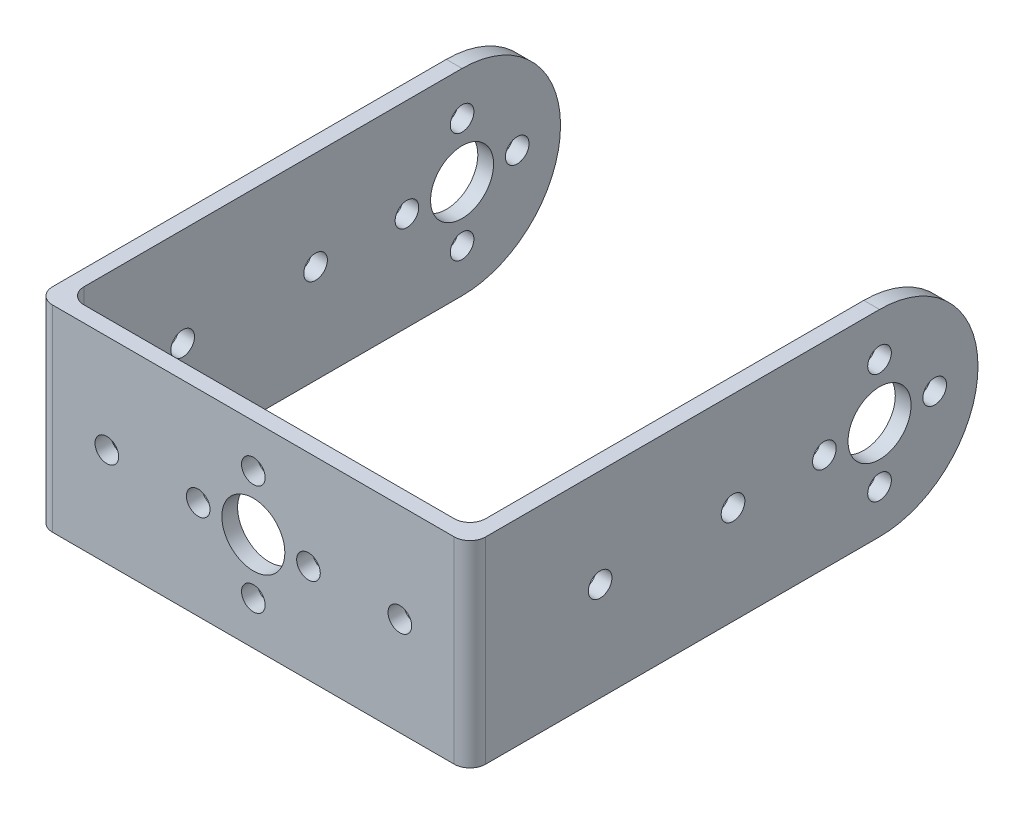
ISO-10303-21;
HEADER;
FILE_DESCRIPTION(('STEP AP214'),'2;1');
FILE_NAME('part.step','',(''),(''),'','','');
FILE_SCHEMA(('AUTOMOTIVE_DESIGN { 1 0 10303 214 1 1 1 1 }'));
ENDSEC;
DATA;
#1=APPLICATION_CONTEXT('core data for automotive mechanical design processes');
#2=APPLICATION_PROTOCOL_DEFINITION('international standard','automotive_design',2000,#1);
#3=PRODUCT_CONTEXT('',#1,'mechanical');
#4=PRODUCT('Part','Part','',(#3));
#5=PRODUCT_RELATED_PRODUCT_CATEGORY('part','',(#4));
#6=PRODUCT_DEFINITION_FORMATION('','',#4);
#7=PRODUCT_DEFINITION_CONTEXT('part definition',#1,'design');
#8=PRODUCT_DEFINITION('design','',#6,#7);
#9=PRODUCT_DEFINITION_SHAPE('','',#8);
#10=(LENGTH_UNIT() NAMED_UNIT(*) SI_UNIT(.MILLI.,.METRE.));
#11=(NAMED_UNIT(*) PLANE_ANGLE_UNIT() SI_UNIT($,.RADIAN.));
#12=(NAMED_UNIT(*) SI_UNIT($,.STERADIAN.) SOLID_ANGLE_UNIT());
#13=UNCERTAINTY_MEASURE_WITH_UNIT(LENGTH_MEASURE(1.E-05),#10,'distance_accuracy_value','');
#14=(GEOMETRIC_REPRESENTATION_CONTEXT(3) GLOBAL_UNCERTAINTY_ASSIGNED_CONTEXT((#13)) GLOBAL_UNIT_ASSIGNED_CONTEXT((#10,
#11,#12)) REPRESENTATION_CONTEXT('',''));
#15=CARTESIAN_POINT('',(0.,0.,0.));
#16=DIRECTION('',(0.,0.,1.));
#17=DIRECTION('',(1.,0.,0.));
#18=AXIS2_PLACEMENT_3D('',#15,#16,#17);
#19=CARTESIAN_POINT('',(0.,0.,0.));
#20=DIRECTION('',(0.,1.,0.));
#21=DIRECTION('',(0.,0.,1.));
#22=AXIS2_PLACEMENT_3D('',#19,#20,#21);
#23=PLANE('',#22);
#24=DIRECTION('',(0.,0.,-1.));
#25=VECTOR('',#24,1.);
#26=CARTESIAN_POINT('',(27.5,0.,0.));
#27=LINE('',#26,#25);
#28=CARTESIAN_POINT('',(27.5,0.,-2.));
#29=VERTEX_POINT('',#28);
#30=CARTESIAN_POINT('',(27.5,0.,-52.));
#31=VERTEX_POINT('',#30);
#32=EDGE_CURVE('E390',#29,#31,#27,.T.);
#33=ORIENTED_EDGE('',*,*,#32,.F.);
#34=CARTESIAN_POINT('',(25.5,0.,-2.));
#35=DIRECTION('',(0.,1.,0.));
#36=DIRECTION('',(0.,0.,1.));
#37=AXIS2_PLACEMENT_3D('',#34,#35,#36);
#38=CIRCLE('',#37,2.);
#39=CARTESIAN_POINT('',(25.5,0.,0.));
#40=VERTEX_POINT('',#39);
#41=EDGE_CURVE('E454',#29,#40,#38,.F.);
#42=ORIENTED_EDGE('',*,*,#41,.T.);
#43=DIRECTION('',(1.,0.,0.));
#44=VECTOR('',#43,1.);
#45=CARTESIAN_POINT('',(0.,0.,0.));
#46=LINE('',#45,#44);
#47=CARTESIAN_POINT('',(-25.5,0.,0.));
#48=VERTEX_POINT('',#47);
#49=EDGE_CURVE('E388',#48,#40,#46,.T.);
#50=ORIENTED_EDGE('',*,*,#49,.F.);
#51=CARTESIAN_POINT('',(-25.5,0.,-2.));
#52=DIRECTION('',(0.,1.,0.));
#53=DIRECTION('',(0.,0.,1.));
#54=AXIS2_PLACEMENT_3D('',#51,#52,#53);
#55=CIRCLE('',#54,2.);
#56=CARTESIAN_POINT('',(-27.5,0.,-2.));
#57=VERTEX_POINT('',#56);
#58=EDGE_CURVE('E278',#48,#57,#55,.F.);
#59=ORIENTED_EDGE('',*,*,#58,.T.);
#60=DIRECTION('',(0.,0.,-1.));
#61=VECTOR('',#60,1.);
#62=CARTESIAN_POINT('',(-27.5,0.,0.));
#63=LINE('',#62,#61);
#64=CARTESIAN_POINT('',(-27.5,0.,-52.));
#65=VERTEX_POINT('',#64);
#66=EDGE_CURVE('E270',#57,#65,#63,.T.);
#67=ORIENTED_EDGE('',*,*,#66,.T.);
#68=DIRECTION('',(-1.,0.,0.));
#69=VECTOR('',#68,1.);
#70=CARTESIAN_POINT('',(-2.5,0.,-52.));
#71=LINE('',#70,#69);
#72=CARTESIAN_POINT('',(-25.5,0.,-52.));
#73=VERTEX_POINT('',#72);
#74=EDGE_CURVE('E275',#73,#65,#71,.T.);
#75=ORIENTED_EDGE('',*,*,#74,.F.);
#76=DIRECTION('',(0.,0.,1.));
#77=VECTOR('',#76,1.);
#78=CARTESIAN_POINT('',(-25.5,0.,-64.5));
#79=LINE('',#78,#77);
#80=CARTESIAN_POINT('',(-25.5,0.,-4.));
#81=VERTEX_POINT('',#80);
#82=EDGE_CURVE('E280',#73,#81,#79,.T.);
#83=ORIENTED_EDGE('',*,*,#82,.T.);
#84=CARTESIAN_POINT('',(-23.5,0.,-4.));
#85=DIRECTION('',(0.,1.,0.));
#86=DIRECTION('',(0.,0.,1.));
#87=AXIS2_PLACEMENT_3D('',#84,#85,#86);
#88=CIRCLE('',#87,2.);
#89=CARTESIAN_POINT('',(-23.5,0.,-2.));
#90=VERTEX_POINT('',#89);
#91=EDGE_CURVE('E188',#81,#90,#88,.T.);
#92=ORIENTED_EDGE('',*,*,#91,.T.);
#93=DIRECTION('',(-1.,0.,0.));
#94=VECTOR('',#93,1.);
#95=CARTESIAN_POINT('',(25.5,0.,-2.));
#96=LINE('',#95,#94);
#97=CARTESIAN_POINT('',(23.5,0.,-2.));
#98=VERTEX_POINT('',#97);
#99=EDGE_CURVE('E379',#98,#90,#96,.T.);
#100=ORIENTED_EDGE('',*,*,#99,.F.);
#101=CARTESIAN_POINT('',(23.5,0.,-4.));
#102=DIRECTION('',(0.,1.,0.));
#103=DIRECTION('',(0.,0.,1.));
#104=AXIS2_PLACEMENT_3D('',#101,#102,#103);
#105=CIRCLE('',#104,2.);
#106=CARTESIAN_POINT('',(25.5,0.,-4.));
#107=VERTEX_POINT('',#106);
#108=EDGE_CURVE('E465',#98,#107,#105,.T.);
#109=ORIENTED_EDGE('',*,*,#108,.T.);
#110=DIRECTION('',(0.,0.,1.));
#111=VECTOR('',#110,1.);
#112=CARTESIAN_POINT('',(25.5,0.,-64.5));
#113=LINE('',#112,#111);
#114=CARTESIAN_POINT('',(25.5,0.,-52.));
#115=VERTEX_POINT('',#114);
#116=EDGE_CURVE('E393',#115,#107,#113,.T.);
#117=ORIENTED_EDGE('',*,*,#116,.F.);
#118=DIRECTION('',(1.,0.,0.));
#119=VECTOR('',#118,1.);
#120=CARTESIAN_POINT('',(2.5,0.,-52.));
#121=LINE('',#120,#119);
#122=EDGE_CURVE('E387',#31,#115,#121,.F.);
#123=ORIENTED_EDGE('',*,*,#122,.F.);
#124=EDGE_LOOP('',(#33,#42,#50,#59,#67,#75,#83,#92,#100,#109,#117,#123));
#125=FACE_BOUND('',#124,.T.);
#126=ADVANCED_FACE('F180',(#125),#23,.F.);
#127=CARTESIAN_POINT('',(0.,25.,0.));
#128=DIRECTION('',(0.,1.,0.));
#129=DIRECTION('',(0.,0.,1.));
#130=AXIS2_PLACEMENT_3D('',#127,#128,#129);
#131=PLANE('',#130);
#132=DIRECTION('',(1.,0.,0.));
#133=VECTOR('',#132,1.);
#134=CARTESIAN_POINT('',(0.,25.,0.));
#135=LINE('',#134,#133);
#136=CARTESIAN_POINT('',(-25.5,25.,0.));
#137=VERTEX_POINT('',#136);
#138=CARTESIAN_POINT('',(25.5,25.,0.));
#139=VERTEX_POINT('',#138);
#140=EDGE_CURVE('E376',#137,#139,#135,.T.);
#141=ORIENTED_EDGE('',*,*,#140,.T.);
#142=CARTESIAN_POINT('',(25.5,25.,-2.));
#143=DIRECTION('',(0.,1.,0.));
#144=DIRECTION('',(0.,0.,1.));
#145=AXIS2_PLACEMENT_3D('',#142,#143,#144);
#146=CIRCLE('',#145,2.);
#147=CARTESIAN_POINT('',(27.5,25.,-2.));
#148=VERTEX_POINT('',#147);
#149=EDGE_CURVE('E462',#139,#148,#146,.T.);
#150=ORIENTED_EDGE('',*,*,#149,.T.);
#151=DIRECTION('',(0.,0.,-1.));
#152=VECTOR('',#151,1.);
#153=CARTESIAN_POINT('',(27.5,25.,0.));
#154=LINE('',#153,#152);
#155=CARTESIAN_POINT('',(27.5,25.,-52.));
#156=VERTEX_POINT('',#155);
#157=EDGE_CURVE('E378',#148,#156,#154,.T.);
#158=ORIENTED_EDGE('',*,*,#157,.T.);
#159=DIRECTION('',(1.,0.,0.));
#160=VECTOR('',#159,1.);
#161=CARTESIAN_POINT('',(2.5,25.,-52.));
#162=LINE('',#161,#160);
#163=CARTESIAN_POINT('',(25.5,25.,-52.));
#164=VERTEX_POINT('',#163);
#165=EDGE_CURVE('E399',#156,#164,#162,.F.);
#166=ORIENTED_EDGE('',*,*,#165,.T.);
#167=DIRECTION('',(0.,0.,1.));
#168=VECTOR('',#167,1.);
#169=CARTESIAN_POINT('',(25.5,25.,-64.5));
#170=LINE('',#169,#168);
#171=CARTESIAN_POINT('',(25.5,25.,-4.));
#172=VERTEX_POINT('',#171);
#173=EDGE_CURVE('E381',#164,#172,#170,.T.);
#174=ORIENTED_EDGE('',*,*,#173,.T.);
#175=CARTESIAN_POINT('',(23.5,25.,-4.));
#176=DIRECTION('',(0.,1.,0.));
#177=DIRECTION('',(0.,0.,1.));
#178=AXIS2_PLACEMENT_3D('',#175,#176,#177);
#179=CIRCLE('',#178,2.);
#180=CARTESIAN_POINT('',(23.5,25.,-2.));
#181=VERTEX_POINT('',#180);
#182=EDGE_CURVE('E467',#172,#181,#179,.F.);
#183=ORIENTED_EDGE('',*,*,#182,.T.);
#184=DIRECTION('',(-1.,0.,0.));
#185=VECTOR('',#184,1.);
#186=CARTESIAN_POINT('',(25.5,25.,-2.));
#187=LINE('',#186,#185);
#188=CARTESIAN_POINT('',(-23.5,25.,-2.));
#189=VERTEX_POINT('',#188);
#190=EDGE_CURVE('E384',#181,#189,#187,.T.);
#191=ORIENTED_EDGE('',*,*,#190,.T.);
#192=CARTESIAN_POINT('',(-23.5,25.,-4.));
#193=DIRECTION('',(0.,1.,0.));
#194=DIRECTION('',(0.,0.,1.));
#195=AXIS2_PLACEMENT_3D('',#192,#193,#194);
#196=CIRCLE('',#195,2.);
#197=CARTESIAN_POINT('',(-25.5,25.,-4.));
#198=VERTEX_POINT('',#197);
#199=EDGE_CURVE('E12',#189,#198,#196,.F.);
#200=ORIENTED_EDGE('',*,*,#199,.T.);
#201=DIRECTION('',(0.,0.,1.));
#202=VECTOR('',#201,1.);
#203=CARTESIAN_POINT('',(-25.5,25.,-64.5));
#204=LINE('',#203,#202);
#205=CARTESIAN_POINT('',(-25.5,25.,-52.));
#206=VERTEX_POINT('',#205);
#207=EDGE_CURVE('E279',#206,#198,#204,.T.);
#208=ORIENTED_EDGE('',*,*,#207,.F.);
#209=DIRECTION('',(-1.,0.,0.));
#210=VECTOR('',#209,1.);
#211=CARTESIAN_POINT('',(-2.5,25.,-52.));
#212=LINE('',#211,#210);
#213=CARTESIAN_POINT('',(-27.5,25.,-52.));
#214=VERTEX_POINT('',#213);
#215=EDGE_CURVE('E288',#206,#214,#212,.T.);
#216=ORIENTED_EDGE('',*,*,#215,.T.);
#217=DIRECTION('',(0.,0.,-1.));
#218=VECTOR('',#217,1.);
#219=CARTESIAN_POINT('',(-27.5,25.,0.));
#220=LINE('',#219,#218);
#221=CARTESIAN_POINT('',(-27.5,25.,-2.));
#222=VERTEX_POINT('',#221);
#223=EDGE_CURVE('E285',#222,#214,#220,.T.);
#224=ORIENTED_EDGE('',*,*,#223,.F.);
#225=CARTESIAN_POINT('',(-25.5,25.,-2.));
#226=DIRECTION('',(0.,1.,0.));
#227=DIRECTION('',(0.,0.,1.));
#228=AXIS2_PLACEMENT_3D('',#225,#226,#227);
#229=CIRCLE('',#228,2.);
#230=EDGE_CURVE('E460',#222,#137,#229,.T.);
#231=ORIENTED_EDGE('',*,*,#230,.T.);
#232=EDGE_LOOP('',(#141,#150,#158,#166,#174,#183,#191,#200,#208,#216,#224,#231));
#233=FACE_BOUND('',#232,.T.);
#234=ADVANCED_FACE('F480',(#233),#131,.T.);
#235=CARTESIAN_POINT('',(0.,25.,0.));
#236=DIRECTION('',(0.,0.,-1.));
#237=DIRECTION('',(-1.,0.,0.));
#238=AXIS2_PLACEMENT_3D('',#235,#236,#237);
#239=PLANE('',#238);
#240=CARTESIAN_POINT('',(18.6,12.5,0.));
#241=DIRECTION('',(0.,0.,1.));
#242=DIRECTION('',(1.,0.,0.));
#243=AXIS2_PLACEMENT_3D('',#240,#241,#242);
#244=CIRCLE('',#243,1.5);
#245=CARTESIAN_POINT('',(20.1,12.5,0.));
#246=VERTEX_POINT('',#245);
#247=EDGE_CURVE('E867',#246,#246,#244,.T.);
#248=ORIENTED_EDGE('',*,*,#247,.F.);
#249=EDGE_LOOP('',(#248));
#250=FACE_BOUND('',#249,.T.);
#251=CARTESIAN_POINT('',(0.,5.5,0.));
#252=DIRECTION('',(0.,0.,1.));
#253=DIRECTION('',(1.,0.,0.));
#254=AXIS2_PLACEMENT_3D('',#251,#252,#253);
#255=CIRCLE('',#254,1.5);
#256=CARTESIAN_POINT('',(1.5,5.5,0.));
#257=VERTEX_POINT('',#256);
#258=EDGE_CURVE('E887',#257,#257,#255,.T.);
#259=ORIENTED_EDGE('',*,*,#258,.F.);
#260=EDGE_LOOP('',(#259));
#261=FACE_BOUND('',#260,.T.);
#262=CARTESIAN_POINT('',(-7.,12.5,0.));
#263=DIRECTION('',(0.,0.,1.));
#264=DIRECTION('',(1.,0.,0.));
#265=AXIS2_PLACEMENT_3D('',#262,#263,#264);
#266=CIRCLE('',#265,1.5);
#267=CARTESIAN_POINT('',(-5.5,12.5,0.));
#268=VERTEX_POINT('',#267);
#269=EDGE_CURVE('E891',#268,#268,#266,.T.);
#270=ORIENTED_EDGE('',*,*,#269,.F.);
#271=EDGE_LOOP('',(#270));
#272=FACE_BOUND('',#271,.T.);
#273=CARTESIAN_POINT('',(0.,19.5,0.));
#274=DIRECTION('',(0.,0.,1.));
#275=DIRECTION('',(1.,0.,0.));
#276=AXIS2_PLACEMENT_3D('',#273,#274,#275);
#277=CIRCLE('',#276,1.5);
#278=CARTESIAN_POINT('',(1.5,19.5,0.));
#279=VERTEX_POINT('',#278);
#280=EDGE_CURVE('E898',#279,#279,#277,.T.);
#281=ORIENTED_EDGE('',*,*,#280,.F.);
#282=EDGE_LOOP('',(#281));
#283=FACE_BOUND('',#282,.T.);
#284=CARTESIAN_POINT('',(-18.6,12.5,0.));
#285=DIRECTION('',(0.,0.,1.));
#286=DIRECTION('',(1.,0.,0.));
#287=AXIS2_PLACEMENT_3D('',#284,#285,#286);
#288=CIRCLE('',#287,1.5);
#289=CARTESIAN_POINT('',(-17.1,12.5,0.));
#290=VERTEX_POINT('',#289);
#291=EDGE_CURVE('E888',#290,#290,#288,.T.);
#292=ORIENTED_EDGE('',*,*,#291,.F.);
#293=EDGE_LOOP('',(#292));
#294=FACE_BOUND('',#293,.T.);
#295=CARTESIAN_POINT('',(0.,12.5,0.));
#296=DIRECTION('',(0.,0.,1.));
#297=DIRECTION('',(1.,0.,0.));
#298=AXIS2_PLACEMENT_3D('',#295,#296,#297);
#299=CIRCLE('',#298,4.);
#300=CARTESIAN_POINT('',(4.,12.5,0.));
#301=VERTEX_POINT('',#300);
#302=EDGE_CURVE('E894',#301,#301,#299,.T.);
#303=ORIENTED_EDGE('',*,*,#302,.F.);
#304=EDGE_LOOP('',(#303));
#305=FACE_BOUND('',#304,.T.);
#306=CARTESIAN_POINT('',(7.,12.5,0.));
#307=DIRECTION('',(0.,0.,1.));
#308=DIRECTION('',(1.,0.,0.));
#309=AXIS2_PLACEMENT_3D('',#306,#307,#308);
#310=CIRCLE('',#309,1.5);
#311=CARTESIAN_POINT('',(8.5,12.5,0.));
#312=VERTEX_POINT('',#311);
#313=EDGE_CURVE('E302',#312,#312,#310,.T.);
#314=ORIENTED_EDGE('',*,*,#313,.F.);
#315=EDGE_LOOP('',(#314));
#316=FACE_BOUND('',#315,.T.);
#317=ORIENTED_EDGE('',*,*,#49,.T.);
#318=DIRECTION('',(0.,-1.,0.));
#319=VECTOR('',#318,1.);
#320=CARTESIAN_POINT('',(25.5,25.,0.));
#321=LINE('',#320,#319);
#322=EDGE_CURVE('E203',#40,#139,#321,.F.);
#323=ORIENTED_EDGE('',*,*,#322,.T.);
#324=ORIENTED_EDGE('',*,*,#140,.F.);
#325=DIRECTION('',(0.,-1.,0.));
#326=VECTOR('',#325,1.);
#327=CARTESIAN_POINT('',(-25.5,0.,0.));
#328=LINE('',#327,#326);
#329=EDGE_CURVE('E456',#137,#48,#328,.T.);
#330=ORIENTED_EDGE('',*,*,#329,.T.);
#331=EDGE_LOOP('',(#317,#323,#324,#330));
#332=FACE_BOUND('',#331,.T.);
#333=ADVANCED_FACE('F503',(#250,#261,#272,#283,#294,#305,#316,#332),#239,.F.);
#334=CARTESIAN_POINT('',(27.5,25.,0.));
#335=DIRECTION('',(-1.,0.,0.));
#336=DIRECTION('',(0.,0.,1.));
#337=AXIS2_PLACEMENT_3D('',#334,#335,#336);
#338=PLANE('',#337);
#339=CARTESIAN_POINT('',(27.5,12.5,-33.4));
#340=DIRECTION('',(1.,0.,0.));
#341=DIRECTION('',(0.,0.,-1.));
#342=AXIS2_PLACEMENT_3D('',#339,#340,#341);
#343=CIRCLE('',#342,1.5);
#344=CARTESIAN_POINT('',(27.5,12.5,-34.9));
#345=VERTEX_POINT('',#344);
#346=EDGE_CURVE('E346',#345,#345,#343,.T.);
#347=ORIENTED_EDGE('',*,*,#346,.F.);
#348=EDGE_LOOP('',(#347));
#349=FACE_BOUND('',#348,.T.);
#350=CARTESIAN_POINT('',(27.5,12.5,-16.53));
#351=DIRECTION('',(1.,0.,0.));
#352=DIRECTION('',(0.,0.,-1.));
#353=AXIS2_PLACEMENT_3D('',#350,#351,#352);
#354=CIRCLE('',#353,1.5);
#355=CARTESIAN_POINT('',(27.5,12.5,-18.03));
#356=VERTEX_POINT('',#355);
#357=EDGE_CURVE('E351',#356,#356,#354,.T.);
#358=ORIENTED_EDGE('',*,*,#357,.F.);
#359=EDGE_LOOP('',(#358));
#360=FACE_BOUND('',#359,.T.);
#361=CARTESIAN_POINT('',(27.5,5.5,-52.));
#362=DIRECTION('',(1.,0.,0.));
#363=DIRECTION('',(0.,0.,-1.));
#364=AXIS2_PLACEMENT_3D('',#361,#362,#363);
#365=CIRCLE('',#364,1.5);
#366=CARTESIAN_POINT('',(27.5,5.5,-53.5));
#367=VERTEX_POINT('',#366);
#368=EDGE_CURVE('E359',#367,#367,#365,.T.);
#369=ORIENTED_EDGE('',*,*,#368,.F.);
#370=EDGE_LOOP('',(#369));
#371=FACE_BOUND('',#370,.T.);
#372=CARTESIAN_POINT('',(27.5,12.5,-45.));
#373=DIRECTION('',(1.,0.,0.));
#374=DIRECTION('',(0.,0.,-1.));
#375=AXIS2_PLACEMENT_3D('',#372,#373,#374);
#376=CIRCLE('',#375,1.5);
#377=CARTESIAN_POINT('',(27.5,12.5,-46.5));
#378=VERTEX_POINT('',#377);
#379=EDGE_CURVE('E355',#378,#378,#376,.T.);
#380=ORIENTED_EDGE('',*,*,#379,.F.);
#381=EDGE_LOOP('',(#380));
#382=FACE_BOUND('',#381,.T.);
#383=CARTESIAN_POINT('',(27.5,12.5,-52.));
#384=DIRECTION('',(1.,0.,0.));
#385=DIRECTION('',(0.,0.,-1.));
#386=AXIS2_PLACEMENT_3D('',#383,#384,#385);
#387=CIRCLE('',#386,4.00000000000001);
#388=CARTESIAN_POINT('',(27.5,12.5,-56.));
#389=VERTEX_POINT('',#388);
#390=EDGE_CURVE('E366',#389,#389,#387,.T.);
#391=ORIENTED_EDGE('',*,*,#390,.F.);
#392=EDGE_LOOP('',(#391));
#393=FACE_BOUND('',#392,.T.);
#394=CARTESIAN_POINT('',(27.5,19.5,-52.));
#395=DIRECTION('',(1.,0.,0.));
#396=DIRECTION('',(0.,0.,-1.));
#397=AXIS2_PLACEMENT_3D('',#394,#395,#396);
#398=CIRCLE('',#397,1.5);
#399=CARTESIAN_POINT('',(27.5,19.5,-53.5));
#400=VERTEX_POINT('',#399);
#401=EDGE_CURVE('E363',#400,#400,#398,.T.);
#402=ORIENTED_EDGE('',*,*,#401,.F.);
#403=EDGE_LOOP('',(#402));
#404=FACE_BOUND('',#403,.T.);
#405=CARTESIAN_POINT('',(27.5,12.5,-59.));
#406=DIRECTION('',(1.,0.,0.));
#407=DIRECTION('',(0.,0.,-1.));
#408=AXIS2_PLACEMENT_3D('',#405,#406,#407);
#409=CIRCLE('',#408,1.5);
#410=CARTESIAN_POINT('',(27.5,12.5,-60.5));
#411=VERTEX_POINT('',#410);
#412=EDGE_CURVE('E362',#411,#411,#409,.T.);
#413=ORIENTED_EDGE('',*,*,#412,.F.);
#414=EDGE_LOOP('',(#413));
#415=FACE_BOUND('',#414,.T.);
#416=ORIENTED_EDGE('',*,*,#157,.F.);
#417=DIRECTION('',(0.,-1.,0.));
#418=VECTOR('',#417,1.);
#419=CARTESIAN_POINT('',(27.5,25.,-2.));
#420=LINE('',#419,#418);
#421=EDGE_CURVE('E450',#148,#29,#420,.T.);
#422=ORIENTED_EDGE('',*,*,#421,.T.);
#423=ORIENTED_EDGE('',*,*,#32,.T.);
#424=CARTESIAN_POINT('',(27.5,12.5,-52.));
#425=DIRECTION('',(1.,0.,0.));
#426=DIRECTION('',(0.,0.,-1.));
#427=AXIS2_PLACEMENT_3D('',#424,#425,#426);
#428=CIRCLE('',#427,12.5);
#429=EDGE_CURVE('E356',#156,#31,#428,.F.);
#430=ORIENTED_EDGE('',*,*,#429,.F.);
#431=EDGE_LOOP('',(#416,#422,#423,#430));
#432=FACE_BOUND('',#431,.T.);
#433=ADVANCED_FACE('F514',(#349,#360,#371,#382,#393,#404,#415,#432),#338,.F.);
#434=CARTESIAN_POINT('',(25.5,25.,-64.5));
#435=DIRECTION('',(1.,0.,0.));
#436=DIRECTION('',(0.,0.,-1.));
#437=AXIS2_PLACEMENT_3D('',#434,#435,#436);
#438=PLANE('',#437);
#439=CARTESIAN_POINT('',(25.5,12.5,-33.4));
#440=DIRECTION('',(1.,0.,0.));
#441=DIRECTION('',(0.,0.,-1.));
#442=AXIS2_PLACEMENT_3D('',#439,#440,#441);
#443=CIRCLE('',#442,1.5);
#444=CARTESIAN_POINT('',(25.5,12.5,-34.9));
#445=VERTEX_POINT('',#444);
#446=EDGE_CURVE('E350',#445,#445,#443,.T.);
#447=ORIENTED_EDGE('',*,*,#446,.T.);
#448=EDGE_LOOP('',(#447));
#449=FACE_BOUND('',#448,.T.);
#450=CARTESIAN_POINT('',(25.5,12.5,-16.53));
#451=DIRECTION('',(1.,0.,0.));
#452=DIRECTION('',(0.,0.,-1.));
#453=AXIS2_PLACEMENT_3D('',#450,#451,#452);
#454=CIRCLE('',#453,1.5);
#455=CARTESIAN_POINT('',(25.5,12.5,-18.03));
#456=VERTEX_POINT('',#455);
#457=EDGE_CURVE('E391',#456,#456,#454,.T.);
#458=ORIENTED_EDGE('',*,*,#457,.T.);
#459=EDGE_LOOP('',(#458));
#460=FACE_BOUND('',#459,.T.);
#461=CARTESIAN_POINT('',(25.5,5.5,-52.));
#462=DIRECTION('',(1.,0.,0.));
#463=DIRECTION('',(0.,0.,-1.));
#464=AXIS2_PLACEMENT_3D('',#461,#462,#463);
#465=CIRCLE('',#464,1.5);
#466=CARTESIAN_POINT('',(25.5,5.5,-53.5));
#467=VERTEX_POINT('',#466);
#468=EDGE_CURVE('E411',#467,#467,#465,.T.);
#469=ORIENTED_EDGE('',*,*,#468,.T.);
#470=EDGE_LOOP('',(#469));
#471=FACE_BOUND('',#470,.T.);
#472=CARTESIAN_POINT('',(25.5,12.5,-45.));
#473=DIRECTION('',(1.,0.,0.));
#474=DIRECTION('',(0.,0.,-1.));
#475=AXIS2_PLACEMENT_3D('',#472,#473,#474);
#476=CIRCLE('',#475,1.5);
#477=CARTESIAN_POINT('',(25.5,12.5,-46.5));
#478=VERTEX_POINT('',#477);
#479=EDGE_CURVE('E408',#478,#478,#476,.T.);
#480=ORIENTED_EDGE('',*,*,#479,.T.);
#481=EDGE_LOOP('',(#480));
#482=FACE_BOUND('',#481,.T.);
#483=CARTESIAN_POINT('',(25.5,12.5,-52.));
#484=DIRECTION('',(1.,0.,0.));
#485=DIRECTION('',(0.,0.,-1.));
#486=AXIS2_PLACEMENT_3D('',#483,#484,#485);
#487=CIRCLE('',#486,4.00000000000001);
#488=CARTESIAN_POINT('',(25.5,12.5,-56.));
#489=VERTEX_POINT('',#488);
#490=EDGE_CURVE('E405',#489,#489,#487,.T.);
#491=ORIENTED_EDGE('',*,*,#490,.T.);
#492=EDGE_LOOP('',(#491));
#493=FACE_BOUND('',#492,.T.);
#494=CARTESIAN_POINT('',(25.5,19.5,-52.));
#495=DIRECTION('',(1.,0.,0.));
#496=DIRECTION('',(0.,0.,-1.));
#497=AXIS2_PLACEMENT_3D('',#494,#495,#496);
#498=CIRCLE('',#497,1.5);
#499=CARTESIAN_POINT('',(25.5,19.5,-53.5));
#500=VERTEX_POINT('',#499);
#501=EDGE_CURVE('E402',#500,#500,#498,.T.);
#502=ORIENTED_EDGE('',*,*,#501,.T.);
#503=EDGE_LOOP('',(#502));
#504=FACE_BOUND('',#503,.T.);
#505=CARTESIAN_POINT('',(25.5,12.5,-59.));
#506=DIRECTION('',(1.,0.,0.));
#507=DIRECTION('',(0.,0.,-1.));
#508=AXIS2_PLACEMENT_3D('',#505,#506,#507);
#509=CIRCLE('',#508,1.5);
#510=CARTESIAN_POINT('',(25.5,12.5,-60.5));
#511=VERTEX_POINT('',#510);
#512=EDGE_CURVE('E375',#511,#511,#509,.T.);
#513=ORIENTED_EDGE('',*,*,#512,.T.);
#514=EDGE_LOOP('',(#513));
#515=FACE_BOUND('',#514,.T.);
#516=ORIENTED_EDGE('',*,*,#116,.T.);
#517=DIRECTION('',(0.,-1.,0.));
#518=VECTOR('',#517,1.);
#519=CARTESIAN_POINT('',(25.5,25.,-4.));
#520=LINE('',#519,#518);
#521=EDGE_CURVE('E445',#107,#172,#520,.F.);
#522=ORIENTED_EDGE('',*,*,#521,.T.);
#523=ORIENTED_EDGE('',*,*,#173,.F.);
#524=CARTESIAN_POINT('',(25.5,12.5,-52.));
#525=DIRECTION('',(1.,0.,0.));
#526=DIRECTION('',(0.,0.,-1.));
#527=AXIS2_PLACEMENT_3D('',#524,#525,#526);
#528=CIRCLE('',#527,12.5);
#529=EDGE_CURVE('E354',#164,#115,#528,.F.);
#530=ORIENTED_EDGE('',*,*,#529,.T.);
#531=EDGE_LOOP('',(#516,#522,#523,#530));
#532=FACE_BOUND('',#531,.T.);
#533=ADVANCED_FACE('F510',(#449,#460,#471,#482,#493,#504,#515,#532),#438,.F.);
#534=CARTESIAN_POINT('',(25.5,25.,-2.));
#535=DIRECTION('',(0.,0.,1.));
#536=DIRECTION('',(1.,0.,0.));
#537=AXIS2_PLACEMENT_3D('',#534,#535,#536);
#538=PLANE('',#537);
#539=CARTESIAN_POINT('',(18.6,12.5,-2.));
#540=DIRECTION('',(0.,0.,1.));
#541=DIRECTION('',(1.,0.,0.));
#542=AXIS2_PLACEMENT_3D('',#539,#540,#541);
#543=CIRCLE('',#542,1.5);
#544=CARTESIAN_POINT('',(20.1,12.5,-2.));
#545=VERTEX_POINT('',#544);
#546=EDGE_CURVE('E299',#545,#545,#543,.T.);
#547=ORIENTED_EDGE('',*,*,#546,.T.);
#548=EDGE_LOOP('',(#547));
#549=FACE_BOUND('',#548,.T.);
#550=CARTESIAN_POINT('',(0.,5.5,-2.));
#551=DIRECTION('',(0.,0.,1.));
#552=DIRECTION('',(1.,0.,0.));
#553=AXIS2_PLACEMENT_3D('',#550,#551,#552);
#554=CIRCLE('',#553,1.5);
#555=CARTESIAN_POINT('',(1.5,5.5,-2.));
#556=VERTEX_POINT('',#555);
#557=EDGE_CURVE('E436',#556,#556,#554,.T.);
#558=ORIENTED_EDGE('',*,*,#557,.T.);
#559=EDGE_LOOP('',(#558));
#560=FACE_BOUND('',#559,.T.);
#561=CARTESIAN_POINT('',(-7.,12.5,-2.));
#562=DIRECTION('',(0.,0.,1.));
#563=DIRECTION('',(1.,0.,0.));
#564=AXIS2_PLACEMENT_3D('',#561,#562,#563);
#565=CIRCLE('',#564,1.5);
#566=CARTESIAN_POINT('',(-5.5,12.5,-2.));
#567=VERTEX_POINT('',#566);
#568=EDGE_CURVE('E433',#567,#567,#565,.T.);
#569=ORIENTED_EDGE('',*,*,#568,.T.);
#570=EDGE_LOOP('',(#569));
#571=FACE_BOUND('',#570,.T.);
#572=CARTESIAN_POINT('',(0.,19.5,-2.));
#573=DIRECTION('',(0.,0.,1.));
#574=DIRECTION('',(1.,0.,0.));
#575=AXIS2_PLACEMENT_3D('',#572,#573,#574);
#576=CIRCLE('',#575,1.5);
#577=CARTESIAN_POINT('',(1.5,19.5,-2.));
#578=VERTEX_POINT('',#577);
#579=EDGE_CURVE('E430',#578,#578,#576,.T.);
#580=ORIENTED_EDGE('',*,*,#579,.T.);
#581=EDGE_LOOP('',(#580));
#582=FACE_BOUND('',#581,.T.);
#583=CARTESIAN_POINT('',(-18.6,12.5,-1.99999999999999));
#584=DIRECTION('',(0.,0.,1.));
#585=DIRECTION('',(1.,0.,0.));
#586=AXIS2_PLACEMENT_3D('',#583,#584,#585);
#587=CIRCLE('',#586,1.5);
#588=CARTESIAN_POINT('',(-17.1,12.5,-1.99999999999999));
#589=VERTEX_POINT('',#588);
#590=EDGE_CURVE('E427',#589,#589,#587,.T.);
#591=ORIENTED_EDGE('',*,*,#590,.T.);
#592=EDGE_LOOP('',(#591));
#593=FACE_BOUND('',#592,.T.);
#594=CARTESIAN_POINT('',(0.,12.5,-2.));
#595=DIRECTION('',(0.,0.,1.));
#596=DIRECTION('',(1.,0.,0.));
#597=AXIS2_PLACEMENT_3D('',#594,#595,#596);
#598=CIRCLE('',#597,4.);
#599=CARTESIAN_POINT('',(4.,12.5,-2.));
#600=VERTEX_POINT('',#599);
#601=EDGE_CURVE('E424',#600,#600,#598,.T.);
#602=ORIENTED_EDGE('',*,*,#601,.T.);
#603=EDGE_LOOP('',(#602));
#604=FACE_BOUND('',#603,.T.);
#605=CARTESIAN_POINT('',(7.,12.5,-2.));
#606=DIRECTION('',(0.,0.,1.));
#607=DIRECTION('',(1.,0.,0.));
#608=AXIS2_PLACEMENT_3D('',#605,#606,#607);
#609=CIRCLE('',#608,1.5);
#610=CARTESIAN_POINT('',(8.5,12.5,-2.));
#611=VERTEX_POINT('',#610);
#612=EDGE_CURVE('E421',#611,#611,#609,.T.);
#613=ORIENTED_EDGE('',*,*,#612,.T.);
#614=EDGE_LOOP('',(#613));
#615=FACE_BOUND('',#614,.T.);
#616=ORIENTED_EDGE('',*,*,#190,.F.);
#617=DIRECTION('',(0.,-1.,0.));
#618=VECTOR('',#617,1.);
#619=CARTESIAN_POINT('',(23.5,0.,-2.));
#620=LINE('',#619,#618);
#621=EDGE_CURVE('E442',#181,#98,#620,.T.);
#622=ORIENTED_EDGE('',*,*,#621,.T.);
#623=ORIENTED_EDGE('',*,*,#99,.T.);
#624=DIRECTION('',(0.,-1.,0.));
#625=VECTOR('',#624,1.);
#626=CARTESIAN_POINT('',(-23.5,25.,-2.));
#627=LINE('',#626,#625);
#628=EDGE_CURVE('E418',#90,#189,#627,.F.);
#629=ORIENTED_EDGE('',*,*,#628,.T.);
#630=EDGE_LOOP('',(#616,#622,#623,#629));
#631=FACE_BOUND('',#630,.T.);
#632=ADVANCED_FACE('F474',(#549,#560,#571,#582,#593,#604,#615,#631),#538,.F.);
#633=CARTESIAN_POINT('',(2.5,12.5,-52.));
#634=DIRECTION('',(1.,0.,0.));
#635=DIRECTION('',(0.,0.,-1.));
#636=AXIS2_PLACEMENT_3D('',#633,#634,#635);
#637=CYLINDRICAL_SURFACE('',#636,12.5);
#638=ORIENTED_EDGE('',*,*,#529,.F.);
#639=ORIENTED_EDGE('',*,*,#165,.F.);
#640=ORIENTED_EDGE('',*,*,#429,.T.);
#641=ORIENTED_EDGE('',*,*,#122,.T.);
#642=EDGE_LOOP('',(#638,#639,#640,#641));
#643=FACE_BOUND('',#642,.T.);
#644=ADVANCED_FACE('F509',(#643),#637,.T.);
#645=CARTESIAN_POINT('',(2.5,12.5,-59.));
#646=DIRECTION('',(1.,0.,0.));
#647=DIRECTION('',(0.,0.,-1.));
#648=AXIS2_PLACEMENT_3D('',#645,#646,#647);
#649=CYLINDRICAL_SURFACE('',#648,1.5);
#650=ORIENTED_EDGE('',*,*,#412,.T.);
#651=EDGE_LOOP('',(#650));
#652=FACE_BOUND('',#651,.T.);
#653=ORIENTED_EDGE('',*,*,#512,.F.);
#654=EDGE_LOOP('',(#653));
#655=FACE_BOUND('',#654,.T.);
#656=ADVANCED_FACE('F551',(#652,#655),#649,.F.);
#657=CARTESIAN_POINT('',(2.5,19.5,-52.));
#658=DIRECTION('',(1.,0.,0.));
#659=DIRECTION('',(0.,0.,-1.));
#660=AXIS2_PLACEMENT_3D('',#657,#658,#659);
#661=CYLINDRICAL_SURFACE('',#660,1.5);
#662=ORIENTED_EDGE('',*,*,#401,.T.);
#663=EDGE_LOOP('',(#662));
#664=FACE_BOUND('',#663,.T.);
#665=ORIENTED_EDGE('',*,*,#501,.F.);
#666=EDGE_LOOP('',(#665));
#667=FACE_BOUND('',#666,.T.);
#668=ADVANCED_FACE('F556',(#664,#667),#661,.F.);
#669=CARTESIAN_POINT('',(2.5,12.5,-52.));
#670=DIRECTION('',(1.,0.,0.));
#671=DIRECTION('',(0.,0.,-1.));
#672=AXIS2_PLACEMENT_3D('',#669,#670,#671);
#673=CYLINDRICAL_SURFACE('',#672,4.00000000000001);
#674=ORIENTED_EDGE('',*,*,#390,.T.);
#675=EDGE_LOOP('',(#674));
#676=FACE_BOUND('',#675,.T.);
#677=ORIENTED_EDGE('',*,*,#490,.F.);
#678=EDGE_LOOP('',(#677));
#679=FACE_BOUND('',#678,.T.);
#680=ADVANCED_FACE('F567',(#676,#679),#673,.F.);
#681=CARTESIAN_POINT('',(2.5,12.5,-45.));
#682=DIRECTION('',(1.,0.,0.));
#683=DIRECTION('',(0.,0.,-1.));
#684=AXIS2_PLACEMENT_3D('',#681,#682,#683);
#685=CYLINDRICAL_SURFACE('',#684,1.5);
#686=ORIENTED_EDGE('',*,*,#379,.T.);
#687=EDGE_LOOP('',(#686));
#688=FACE_BOUND('',#687,.T.);
#689=ORIENTED_EDGE('',*,*,#479,.F.);
#690=EDGE_LOOP('',(#689));
#691=FACE_BOUND('',#690,.T.);
#692=ADVANCED_FACE('F564',(#688,#691),#685,.F.);
#693=CARTESIAN_POINT('',(2.5,5.5,-52.));
#694=DIRECTION('',(1.,0.,0.));
#695=DIRECTION('',(0.,0.,-1.));
#696=AXIS2_PLACEMENT_3D('',#693,#694,#695);
#697=CYLINDRICAL_SURFACE('',#696,1.5);
#698=ORIENTED_EDGE('',*,*,#368,.T.);
#699=EDGE_LOOP('',(#698));
#700=FACE_BOUND('',#699,.T.);
#701=ORIENTED_EDGE('',*,*,#468,.F.);
#702=EDGE_LOOP('',(#701));
#703=FACE_BOUND('',#702,.T.);
#704=ADVANCED_FACE('F561',(#700,#703),#697,.F.);
#705=CARTESIAN_POINT('',(2.5,12.5,-16.53));
#706=DIRECTION('',(1.,0.,0.));
#707=DIRECTION('',(0.,0.,-1.));
#708=AXIS2_PLACEMENT_3D('',#705,#706,#707);
#709=CYLINDRICAL_SURFACE('',#708,1.5);
#710=ORIENTED_EDGE('',*,*,#357,.T.);
#711=EDGE_LOOP('',(#710));
#712=FACE_BOUND('',#711,.T.);
#713=ORIENTED_EDGE('',*,*,#457,.F.);
#714=EDGE_LOOP('',(#713));
#715=FACE_BOUND('',#714,.T.);
#716=ADVANCED_FACE('F494',(#712,#715),#709,.F.);
#717=CARTESIAN_POINT('',(2.5,12.5,-33.4));
#718=DIRECTION('',(1.,0.,0.));
#719=DIRECTION('',(0.,0.,-1.));
#720=AXIS2_PLACEMENT_3D('',#717,#718,#719);
#721=CYLINDRICAL_SURFACE('',#720,1.5);
#722=ORIENTED_EDGE('',*,*,#346,.T.);
#723=EDGE_LOOP('',(#722));
#724=FACE_BOUND('',#723,.T.);
#725=ORIENTED_EDGE('',*,*,#446,.F.);
#726=EDGE_LOOP('',(#725));
#727=FACE_BOUND('',#726,.T.);
#728=ADVANCED_FACE('F484',(#724,#727),#721,.F.);
#729=CARTESIAN_POINT('',(-25.5,25.,-64.5));
#730=DIRECTION('',(1.,0.,0.));
#731=DIRECTION('',(0.,0.,-1.));
#732=AXIS2_PLACEMENT_3D('',#729,#730,#731);
#733=PLANE('',#732);
#734=CARTESIAN_POINT('',(-25.5,12.5,-33.4));
#735=DIRECTION('',(1.,0.,0.));
#736=DIRECTION('',(0.,0.,-1.));
#737=AXIS2_PLACEMENT_3D('',#734,#735,#736);
#738=CIRCLE('',#737,1.5);
#739=CARTESIAN_POINT('',(-25.5,12.5,-34.9));
#740=VERTEX_POINT('',#739);
#741=EDGE_CURVE('E289',#740,#740,#738,.F.);
#742=ORIENTED_EDGE('',*,*,#741,.T.);
#743=EDGE_LOOP('',(#742));
#744=FACE_BOUND('',#743,.T.);
#745=CARTESIAN_POINT('',(-25.5,12.5,-16.53));
#746=DIRECTION('',(1.,0.,0.));
#747=DIRECTION('',(0.,0.,-1.));
#748=AXIS2_PLACEMENT_3D('',#745,#746,#747);
#749=CIRCLE('',#748,1.5);
#750=CARTESIAN_POINT('',(-25.5,12.5,-18.03));
#751=VERTEX_POINT('',#750);
#752=EDGE_CURVE('E340',#751,#751,#749,.F.);
#753=ORIENTED_EDGE('',*,*,#752,.T.);
#754=EDGE_LOOP('',(#753));
#755=FACE_BOUND('',#754,.T.);
#756=CARTESIAN_POINT('',(-25.5,5.5,-52.));
#757=DIRECTION('',(1.,0.,0.));
#758=DIRECTION('',(0.,0.,-1.));
#759=AXIS2_PLACEMENT_3D('',#756,#757,#758);
#760=CIRCLE('',#759,1.5);
#761=CARTESIAN_POINT('',(-25.5,5.5,-53.5));
#762=VERTEX_POINT('',#761);
#763=EDGE_CURVE('E336',#762,#762,#760,.F.);
#764=ORIENTED_EDGE('',*,*,#763,.T.);
#765=EDGE_LOOP('',(#764));
#766=FACE_BOUND('',#765,.T.);
#767=CARTESIAN_POINT('',(-25.5,12.5,-45.));
#768=DIRECTION('',(1.,0.,0.));
#769=DIRECTION('',(0.,0.,-1.));
#770=AXIS2_PLACEMENT_3D('',#767,#768,#769);
#771=CIRCLE('',#770,1.5);
#772=CARTESIAN_POINT('',(-25.5,12.5,-46.5));
#773=VERTEX_POINT('',#772);
#774=EDGE_CURVE('E333',#773,#773,#771,.F.);
#775=ORIENTED_EDGE('',*,*,#774,.T.);
#776=EDGE_LOOP('',(#775));
#777=FACE_BOUND('',#776,.T.);
#778=CARTESIAN_POINT('',(-25.5,12.5,-52.));
#779=DIRECTION('',(1.,0.,0.));
#780=DIRECTION('',(0.,0.,-1.));
#781=AXIS2_PLACEMENT_3D('',#778,#779,#780);
#782=CIRCLE('',#781,4.00000000000001);
#783=CARTESIAN_POINT('',(-25.5,12.5,-56.));
#784=VERTEX_POINT('',#783);
#785=EDGE_CURVE('E330',#784,#784,#782,.F.);
#786=ORIENTED_EDGE('',*,*,#785,.T.);
#787=EDGE_LOOP('',(#786));
#788=FACE_BOUND('',#787,.T.);
#789=CARTESIAN_POINT('',(-25.5,19.5,-52.));
#790=DIRECTION('',(1.,0.,0.));
#791=DIRECTION('',(0.,0.,-1.));
#792=AXIS2_PLACEMENT_3D('',#789,#790,#791);
#793=CIRCLE('',#792,1.5);
#794=CARTESIAN_POINT('',(-25.5,19.5,-53.5));
#795=VERTEX_POINT('',#794);
#796=EDGE_CURVE('E327',#795,#795,#793,.F.);
#797=ORIENTED_EDGE('',*,*,#796,.T.);
#798=EDGE_LOOP('',(#797));
#799=FACE_BOUND('',#798,.T.);
#800=CARTESIAN_POINT('',(-25.5,12.5,-59.));
#801=DIRECTION('',(1.,0.,0.));
#802=DIRECTION('',(0.,0.,-1.));
#803=AXIS2_PLACEMENT_3D('',#800,#801,#802);
#804=CIRCLE('',#803,1.5);
#805=CARTESIAN_POINT('',(-25.5,12.5,-60.5));
#806=VERTEX_POINT('',#805);
#807=EDGE_CURVE('E308',#806,#806,#804,.F.);
#808=ORIENTED_EDGE('',*,*,#807,.T.);
#809=EDGE_LOOP('',(#808));
#810=FACE_BOUND('',#809,.T.);
#811=ORIENTED_EDGE('',*,*,#207,.T.);
#812=DIRECTION('',(0.,-1.,0.));
#813=VECTOR('',#812,1.);
#814=CARTESIAN_POINT('',(-25.5,25.,-4.));
#815=LINE('',#814,#813);
#816=EDGE_CURVE('E447',#198,#81,#815,.T.);
#817=ORIENTED_EDGE('',*,*,#816,.T.);
#818=ORIENTED_EDGE('',*,*,#82,.F.);
#819=CARTESIAN_POINT('',(-25.5,12.5,-52.));
#820=DIRECTION('',(1.,0.,0.));
#821=DIRECTION('',(0.,0.,-1.));
#822=AXIS2_PLACEMENT_3D('',#819,#820,#821);
#823=CIRCLE('',#822,12.5);
#824=EDGE_CURVE('E293',#73,#206,#823,.T.);
#825=ORIENTED_EDGE('',*,*,#824,.T.);
#826=EDGE_LOOP('',(#811,#817,#818,#825));
#827=FACE_BOUND('',#826,.T.);
#828=ADVANCED_FACE('F482',(#744,#755,#766,#777,#788,#799,#810,#827),#733,.T.);
#829=CARTESIAN_POINT('',(-27.5,25.,0.));
#830=DIRECTION('',(-1.,0.,0.));
#831=DIRECTION('',(0.,0.,1.));
#832=AXIS2_PLACEMENT_3D('',#829,#830,#831);
#833=PLANE('',#832);
#834=CARTESIAN_POINT('',(-27.5,12.5,-33.4));
#835=DIRECTION('',(1.,0.,0.));
#836=DIRECTION('',(0.,0.,-1.));
#837=AXIS2_PLACEMENT_3D('',#834,#835,#836);
#838=CIRCLE('',#837,1.5);
#839=CARTESIAN_POINT('',(-27.5,12.5,-34.9));
#840=VERTEX_POINT('',#839);
#841=EDGE_CURVE('E294',#840,#840,#838,.T.);
#842=ORIENTED_EDGE('',*,*,#841,.T.);
#843=EDGE_LOOP('',(#842));
#844=FACE_BOUND('',#843,.T.);
#845=CARTESIAN_POINT('',(-27.5,12.5,-16.53));
#846=DIRECTION('',(1.,0.,0.));
#847=DIRECTION('',(0.,0.,-1.));
#848=AXIS2_PLACEMENT_3D('',#845,#846,#847);
#849=CIRCLE('',#848,1.5);
#850=CARTESIAN_POINT('',(-27.5,12.5,-18.03));
#851=VERTEX_POINT('',#850);
#852=EDGE_CURVE('E305',#851,#851,#849,.T.);
#853=ORIENTED_EDGE('',*,*,#852,.T.);
#854=EDGE_LOOP('',(#853));
#855=FACE_BOUND('',#854,.T.);
#856=CARTESIAN_POINT('',(-27.5,5.5,-52.));
#857=DIRECTION('',(1.,0.,0.));
#858=DIRECTION('',(0.,0.,-1.));
#859=AXIS2_PLACEMENT_3D('',#856,#857,#858);
#860=CIRCLE('',#859,1.5);
#861=CARTESIAN_POINT('',(-27.5,5.5,-53.5));
#862=VERTEX_POINT('',#861);
#863=EDGE_CURVE('E310',#862,#862,#860,.T.);
#864=ORIENTED_EDGE('',*,*,#863,.T.);
#865=EDGE_LOOP('',(#864));
#866=FACE_BOUND('',#865,.T.);
#867=CARTESIAN_POINT('',(-27.5,12.5,-45.));
#868=DIRECTION('',(1.,0.,0.));
#869=DIRECTION('',(0.,0.,-1.));
#870=AXIS2_PLACEMENT_3D('',#867,#868,#869);
#871=CIRCLE('',#870,1.5);
#872=CARTESIAN_POINT('',(-27.5,12.5,-46.5));
#873=VERTEX_POINT('',#872);
#874=EDGE_CURVE('E309',#873,#873,#871,.T.);
#875=ORIENTED_EDGE('',*,*,#874,.T.);
#876=EDGE_LOOP('',(#875));
#877=FACE_BOUND('',#876,.T.);
#878=CARTESIAN_POINT('',(-27.5,12.5,-52.));
#879=DIRECTION('',(1.,0.,0.));
#880=DIRECTION('',(0.,0.,-1.));
#881=AXIS2_PLACEMENT_3D('',#878,#879,#880);
#882=CIRCLE('',#881,4.00000000000001);
#883=CARTESIAN_POINT('',(-27.5,12.5,-56.));
#884=VERTEX_POINT('',#883);
#885=EDGE_CURVE('E318',#884,#884,#882,.T.);
#886=ORIENTED_EDGE('',*,*,#885,.T.);
#887=EDGE_LOOP('',(#886));
#888=FACE_BOUND('',#887,.T.);
#889=CARTESIAN_POINT('',(-27.5,19.5,-52.));
#890=DIRECTION('',(1.,0.,0.));
#891=DIRECTION('',(0.,0.,-1.));
#892=AXIS2_PLACEMENT_3D('',#889,#890,#891);
#893=CIRCLE('',#892,1.5);
#894=CARTESIAN_POINT('',(-27.5,19.5,-53.5));
#895=VERTEX_POINT('',#894);
#896=EDGE_CURVE('E315',#895,#895,#893,.T.);
#897=ORIENTED_EDGE('',*,*,#896,.T.);
#898=EDGE_LOOP('',(#897));
#899=FACE_BOUND('',#898,.T.);
#900=CARTESIAN_POINT('',(-27.5,12.5,-59.));
#901=DIRECTION('',(1.,0.,0.));
#902=DIRECTION('',(0.,0.,-1.));
#903=AXIS2_PLACEMENT_3D('',#900,#901,#902);
#904=CIRCLE('',#903,1.5);
#905=CARTESIAN_POINT('',(-27.5,12.5,-60.5));
#906=VERTEX_POINT('',#905);
#907=EDGE_CURVE('E312',#906,#906,#904,.T.);
#908=ORIENTED_EDGE('',*,*,#907,.T.);
#909=EDGE_LOOP('',(#908));
#910=FACE_BOUND('',#909,.T.);
#911=ORIENTED_EDGE('',*,*,#66,.F.);
#912=DIRECTION('',(0.,-1.,0.));
#913=VECTOR('',#912,1.);
#914=CARTESIAN_POINT('',(-27.5,25.,-2.));
#915=LINE('',#914,#913);
#916=EDGE_CURVE('E195',#57,#222,#915,.F.);
#917=ORIENTED_EDGE('',*,*,#916,.T.);
#918=ORIENTED_EDGE('',*,*,#223,.T.);
#919=CARTESIAN_POINT('',(-27.5,12.5,-52.));
#920=DIRECTION('',(1.,0.,0.));
#921=DIRECTION('',(0.,0.,-1.));
#922=AXIS2_PLACEMENT_3D('',#919,#920,#921);
#923=CIRCLE('',#922,12.5);
#924=EDGE_CURVE('E283',#214,#65,#923,.F.);
#925=ORIENTED_EDGE('',*,*,#924,.T.);
#926=EDGE_LOOP('',(#911,#917,#918,#925));
#927=FACE_BOUND('',#926,.T.);
#928=ADVANCED_FACE('F284',(#844,#855,#866,#877,#888,#899,#910,#927),#833,.T.);
#929=CARTESIAN_POINT('',(-2.5,12.5,-59.));
#930=DIRECTION('',(-1.,0.,0.));
#931=DIRECTION('',(0.,0.,1.));
#932=AXIS2_PLACEMENT_3D('',#929,#930,#931);
#933=CYLINDRICAL_SURFACE('',#932,1.5);
#934=ORIENTED_EDGE('',*,*,#807,.F.);
#935=EDGE_LOOP('',(#934));
#936=FACE_BOUND('',#935,.T.);
#937=ORIENTED_EDGE('',*,*,#907,.F.);
#938=EDGE_LOOP('',(#937));
#939=FACE_BOUND('',#938,.T.);
#940=ADVANCED_FACE('F491',(#936,#939),#933,.F.);
#941=CARTESIAN_POINT('',(-2.5,19.5,-52.));
#942=DIRECTION('',(-1.,0.,0.));
#943=DIRECTION('',(0.,0.,1.));
#944=AXIS2_PLACEMENT_3D('',#941,#942,#943);
#945=CYLINDRICAL_SURFACE('',#944,1.5);
#946=ORIENTED_EDGE('',*,*,#796,.F.);
#947=EDGE_LOOP('',(#946));
#948=FACE_BOUND('',#947,.T.);
#949=ORIENTED_EDGE('',*,*,#896,.F.);
#950=EDGE_LOOP('',(#949));
#951=FACE_BOUND('',#950,.T.);
#952=ADVANCED_FACE('F621',(#948,#951),#945,.F.);
#953=CARTESIAN_POINT('',(-2.5,12.5,-52.));
#954=DIRECTION('',(-1.,0.,0.));
#955=DIRECTION('',(0.,0.,1.));
#956=AXIS2_PLACEMENT_3D('',#953,#954,#955);
#957=CYLINDRICAL_SURFACE('',#956,4.00000000000001);
#958=ORIENTED_EDGE('',*,*,#785,.F.);
#959=EDGE_LOOP('',(#958));
#960=FACE_BOUND('',#959,.T.);
#961=ORIENTED_EDGE('',*,*,#885,.F.);
#962=EDGE_LOOP('',(#961));
#963=FACE_BOUND('',#962,.T.);
#964=ADVANCED_FACE('F632',(#960,#963),#957,.F.);
#965=CARTESIAN_POINT('',(-2.5,12.5,-45.));
#966=DIRECTION('',(-1.,0.,0.));
#967=DIRECTION('',(0.,0.,1.));
#968=AXIS2_PLACEMENT_3D('',#965,#966,#967);
#969=CYLINDRICAL_SURFACE('',#968,1.5);
#970=ORIENTED_EDGE('',*,*,#774,.F.);
#971=EDGE_LOOP('',(#970));
#972=FACE_BOUND('',#971,.T.);
#973=ORIENTED_EDGE('',*,*,#874,.F.);
#974=EDGE_LOOP('',(#973));
#975=FACE_BOUND('',#974,.T.);
#976=ADVANCED_FACE('F642',(#972,#975),#969,.F.);
#977=CARTESIAN_POINT('',(-2.5,5.5,-52.));
#978=DIRECTION('',(-1.,0.,0.));
#979=DIRECTION('',(0.,0.,1.));
#980=AXIS2_PLACEMENT_3D('',#977,#978,#979);
#981=CYLINDRICAL_SURFACE('',#980,1.5);
#982=ORIENTED_EDGE('',*,*,#763,.F.);
#983=EDGE_LOOP('',(#982));
#984=FACE_BOUND('',#983,.T.);
#985=ORIENTED_EDGE('',*,*,#863,.F.);
#986=EDGE_LOOP('',(#985));
#987=FACE_BOUND('',#986,.T.);
#988=ADVANCED_FACE('F652',(#984,#987),#981,.F.);
#989=CARTESIAN_POINT('',(-2.5,12.5,-52.));
#990=DIRECTION('',(-1.,0.,0.));
#991=DIRECTION('',(0.,0.,1.));
#992=AXIS2_PLACEMENT_3D('',#989,#990,#991);
#993=CYLINDRICAL_SURFACE('',#992,12.5);
#994=ORIENTED_EDGE('',*,*,#824,.F.);
#995=ORIENTED_EDGE('',*,*,#74,.T.);
#996=ORIENTED_EDGE('',*,*,#924,.F.);
#997=ORIENTED_EDGE('',*,*,#215,.F.);
#998=EDGE_LOOP('',(#994,#995,#996,#997));
#999=FACE_BOUND('',#998,.T.);
#1000=ADVANCED_FACE('F291',(#999),#993,.T.);
#1001=CARTESIAN_POINT('',(-2.5,12.5,-16.53));
#1002=DIRECTION('',(-1.,0.,0.));
#1003=DIRECTION('',(0.,0.,1.));
#1004=AXIS2_PLACEMENT_3D('',#1001,#1002,#1003);
#1005=CYLINDRICAL_SURFACE('',#1004,1.5);
#1006=ORIENTED_EDGE('',*,*,#752,.F.);
#1007=EDGE_LOOP('',(#1006));
#1008=FACE_BOUND('',#1007,.T.);
#1009=ORIENTED_EDGE('',*,*,#852,.F.);
#1010=EDGE_LOOP('',(#1009));
#1011=FACE_BOUND('',#1010,.T.);
#1012=ADVANCED_FACE('F671',(#1008,#1011),#1005,.F.);
#1013=CARTESIAN_POINT('',(-2.5,12.5,-33.4));
#1014=DIRECTION('',(-1.,0.,0.));
#1015=DIRECTION('',(0.,0.,1.));
#1016=AXIS2_PLACEMENT_3D('',#1013,#1014,#1015);
#1017=CYLINDRICAL_SURFACE('',#1016,1.5);
#1018=ORIENTED_EDGE('',*,*,#741,.F.);
#1019=EDGE_LOOP('',(#1018));
#1020=FACE_BOUND('',#1019,.T.);
#1021=ORIENTED_EDGE('',*,*,#841,.F.);
#1022=EDGE_LOOP('',(#1021));
#1023=FACE_BOUND('',#1022,.T.);
#1024=ADVANCED_FACE('F680',(#1020,#1023),#1017,.F.);
#1025=CARTESIAN_POINT('',(7.,12.5,-25.));
#1026=DIRECTION('',(0.,0.,1.));
#1027=DIRECTION('',(1.,0.,0.));
#1028=AXIS2_PLACEMENT_3D('',#1025,#1026,#1027);
#1029=CYLINDRICAL_SURFACE('',#1028,1.5);
#1030=ORIENTED_EDGE('',*,*,#313,.T.);
#1031=EDGE_LOOP('',(#1030));
#1032=FACE_BOUND('',#1031,.T.);
#1033=ORIENTED_EDGE('',*,*,#612,.F.);
#1034=EDGE_LOOP('',(#1033));
#1035=FACE_BOUND('',#1034,.T.);
#1036=ADVANCED_FACE('F690',(#1032,#1035),#1029,.F.);
#1037=CARTESIAN_POINT('',(0.,12.5,-25.));
#1038=DIRECTION('',(0.,0.,1.));
#1039=DIRECTION('',(1.,0.,0.));
#1040=AXIS2_PLACEMENT_3D('',#1037,#1038,#1039);
#1041=CYLINDRICAL_SURFACE('',#1040,4.);
#1042=ORIENTED_EDGE('',*,*,#302,.T.);
#1043=EDGE_LOOP('',(#1042));
#1044=FACE_BOUND('',#1043,.T.);
#1045=ORIENTED_EDGE('',*,*,#601,.F.);
#1046=EDGE_LOOP('',(#1045));
#1047=FACE_BOUND('',#1046,.T.);
#1048=ADVANCED_FACE('F700',(#1044,#1047),#1041,.F.);
#1049=CARTESIAN_POINT('',(-18.6,12.5,-25.));
#1050=DIRECTION('',(0.,0.,1.));
#1051=DIRECTION('',(1.,0.,0.));
#1052=AXIS2_PLACEMENT_3D('',#1049,#1050,#1051);
#1053=CYLINDRICAL_SURFACE('',#1052,1.5);
#1054=ORIENTED_EDGE('',*,*,#291,.T.);
#1055=EDGE_LOOP('',(#1054));
#1056=FACE_BOUND('',#1055,.T.);
#1057=ORIENTED_EDGE('',*,*,#590,.F.);
#1058=EDGE_LOOP('',(#1057));
#1059=FACE_BOUND('',#1058,.T.);
#1060=ADVANCED_FACE('F710',(#1056,#1059),#1053,.F.);
#1061=CARTESIAN_POINT('',(0.,19.5,-25.));
#1062=DIRECTION('',(0.,0.,1.));
#1063=DIRECTION('',(1.,0.,0.));
#1064=AXIS2_PLACEMENT_3D('',#1061,#1062,#1063);
#1065=CYLINDRICAL_SURFACE('',#1064,1.5);
#1066=ORIENTED_EDGE('',*,*,#280,.T.);
#1067=EDGE_LOOP('',(#1066));
#1068=FACE_BOUND('',#1067,.T.);
#1069=ORIENTED_EDGE('',*,*,#579,.F.);
#1070=EDGE_LOOP('',(#1069));
#1071=FACE_BOUND('',#1070,.T.);
#1072=ADVANCED_FACE('F720',(#1068,#1071),#1065,.F.);
#1073=CARTESIAN_POINT('',(-7.,12.5,-25.));
#1074=DIRECTION('',(0.,0.,1.));
#1075=DIRECTION('',(1.,0.,0.));
#1076=AXIS2_PLACEMENT_3D('',#1073,#1074,#1075);
#1077=CYLINDRICAL_SURFACE('',#1076,1.5);
#1078=ORIENTED_EDGE('',*,*,#269,.T.);
#1079=EDGE_LOOP('',(#1078));
#1080=FACE_BOUND('',#1079,.T.);
#1081=ORIENTED_EDGE('',*,*,#568,.F.);
#1082=EDGE_LOOP('',(#1081));
#1083=FACE_BOUND('',#1082,.T.);
#1084=ADVANCED_FACE('F730',(#1080,#1083),#1077,.F.);
#1085=CARTESIAN_POINT('',(0.,5.5,-25.));
#1086=DIRECTION('',(0.,0.,1.));
#1087=DIRECTION('',(1.,0.,0.));
#1088=AXIS2_PLACEMENT_3D('',#1085,#1086,#1087);
#1089=CYLINDRICAL_SURFACE('',#1088,1.5);
#1090=ORIENTED_EDGE('',*,*,#258,.T.);
#1091=EDGE_LOOP('',(#1090));
#1092=FACE_BOUND('',#1091,.T.);
#1093=ORIENTED_EDGE('',*,*,#557,.F.);
#1094=EDGE_LOOP('',(#1093));
#1095=FACE_BOUND('',#1094,.T.);
#1096=ADVANCED_FACE('F740',(#1092,#1095),#1089,.F.);
#1097=CARTESIAN_POINT('',(18.6,12.5,-25.));
#1098=DIRECTION('',(0.,0.,1.));
#1099=DIRECTION('',(1.,0.,0.));
#1100=AXIS2_PLACEMENT_3D('',#1097,#1098,#1099);
#1101=CYLINDRICAL_SURFACE('',#1100,1.5);
#1102=ORIENTED_EDGE('',*,*,#247,.T.);
#1103=EDGE_LOOP('',(#1102));
#1104=FACE_BOUND('',#1103,.T.);
#1105=ORIENTED_EDGE('',*,*,#546,.F.);
#1106=EDGE_LOOP('',(#1105));
#1107=FACE_BOUND('',#1106,.T.);
#1108=ADVANCED_FACE('F525',(#1104,#1107),#1101,.F.);
#1109=CARTESIAN_POINT('',(23.5,25.,-4.));
#1110=DIRECTION('',(0.,1.,0.));
#1111=DIRECTION('',(0.,0.,1.));
#1112=AXIS2_PLACEMENT_3D('',#1109,#1110,#1111);
#1113=CYLINDRICAL_SURFACE('',#1112,2.);
#1114=ORIENTED_EDGE('',*,*,#182,.F.);
#1115=ORIENTED_EDGE('',*,*,#521,.F.);
#1116=ORIENTED_EDGE('',*,*,#108,.F.);
#1117=ORIENTED_EDGE('',*,*,#621,.F.);
#1118=EDGE_LOOP('',(#1114,#1115,#1116,#1117));
#1119=FACE_BOUND('',#1118,.T.);
#1120=ADVANCED_FACE('F522',(#1119),#1113,.F.);
#1121=CARTESIAN_POINT('',(-23.5,25.,-4.));
#1122=DIRECTION('',(0.,-1.,0.));
#1123=DIRECTION('',(0.,0.,-1.));
#1124=AXIS2_PLACEMENT_3D('',#1121,#1122,#1123);
#1125=CYLINDRICAL_SURFACE('',#1124,2.);
#1126=ORIENTED_EDGE('',*,*,#199,.F.);
#1127=ORIENTED_EDGE('',*,*,#628,.F.);
#1128=ORIENTED_EDGE('',*,*,#91,.F.);
#1129=ORIENTED_EDGE('',*,*,#816,.F.);
#1130=EDGE_LOOP('',(#1126,#1127,#1128,#1129));
#1131=FACE_BOUND('',#1130,.T.);
#1132=ADVANCED_FACE('F477',(#1131),#1125,.F.);
#1133=CARTESIAN_POINT('',(25.5,25.,-2.));
#1134=DIRECTION('',(0.,-1.,0.));
#1135=DIRECTION('',(0.,0.,-1.));
#1136=AXIS2_PLACEMENT_3D('',#1133,#1134,#1135);
#1137=CYLINDRICAL_SURFACE('',#1136,2.);
#1138=ORIENTED_EDGE('',*,*,#149,.F.);
#1139=ORIENTED_EDGE('',*,*,#322,.F.);
#1140=ORIENTED_EDGE('',*,*,#41,.F.);
#1141=ORIENTED_EDGE('',*,*,#421,.F.);
#1142=EDGE_LOOP('',(#1138,#1139,#1140,#1141));
#1143=FACE_BOUND('',#1142,.T.);
#1144=ADVANCED_FACE('F528',(#1143),#1137,.T.);
#1145=CARTESIAN_POINT('',(-25.5,25.,-2.));
#1146=DIRECTION('',(0.,1.,0.));
#1147=DIRECTION('',(0.,0.,1.));
#1148=AXIS2_PLACEMENT_3D('',#1145,#1146,#1147);
#1149=CYLINDRICAL_SURFACE('',#1148,2.);
#1150=ORIENTED_EDGE('',*,*,#230,.F.);
#1151=ORIENTED_EDGE('',*,*,#916,.F.);
#1152=ORIENTED_EDGE('',*,*,#58,.F.);
#1153=ORIENTED_EDGE('',*,*,#329,.F.);
#1154=EDGE_LOOP('',(#1150,#1151,#1152,#1153));
#1155=FACE_BOUND('',#1154,.T.);
#1156=ADVANCED_FACE('F182',(#1155),#1149,.T.);
#1157=CLOSED_SHELL('',(#126,#234,#333,#433,#533,#632,#644,#656,#668,#680,#692,#704,#716,#728,
#828,#928,#940,#952,#964,#976,#988,#1000,#1012,#1024,#1036,#1048,#1060,#1072,#1084,#1096,#1108,
#1120,#1132,#1144,#1156));
#1158=MANIFOLD_SOLID_BREP('B2',#1157);
#1159=ADVANCED_BREP_SHAPE_REPRESENTATION('',(#18,#1158),#14);
#1160=SHAPE_DEFINITION_REPRESENTATION(#9,#1159);
ENDSEC;
END-ISO-10303-21;
